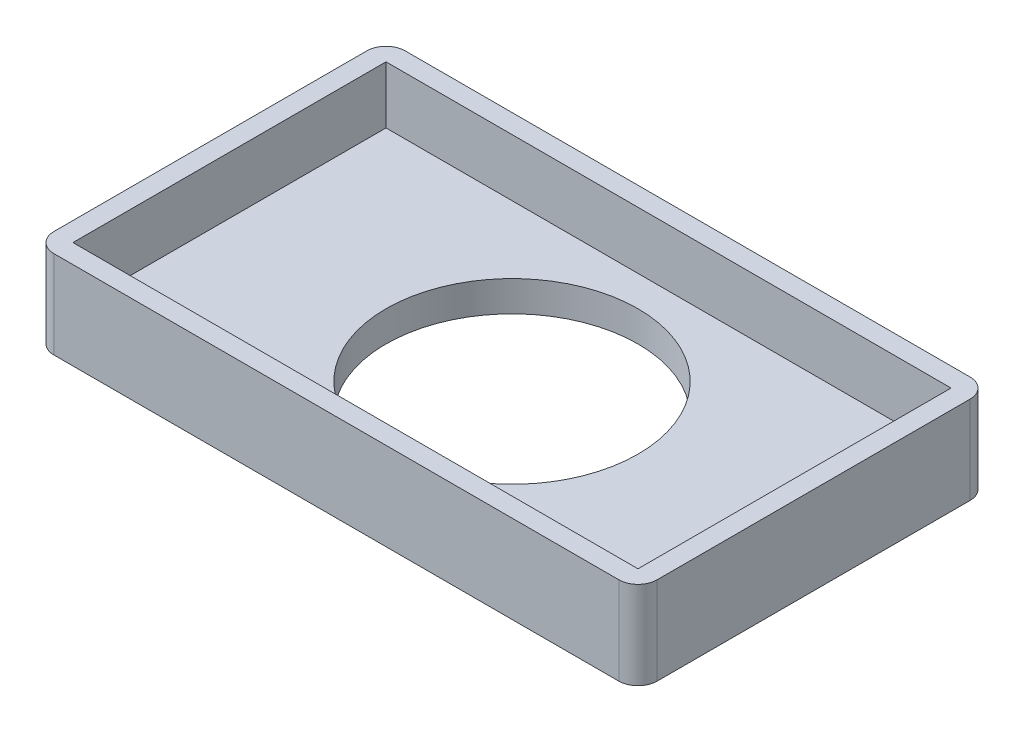
ISO-10303-21;
HEADER;
FILE_DESCRIPTION(('STEP AP214'),'2;1');
FILE_NAME('part.step','',(''),(''),'','','');
FILE_SCHEMA(('AUTOMOTIVE_DESIGN { 1 0 10303 214 1 1 1 1 }'));
ENDSEC;
DATA;
#1=APPLICATION_CONTEXT('core data for automotive mechanical design processes');
#2=APPLICATION_PROTOCOL_DEFINITION('international standard','automotive_design',2000,#1);
#3=PRODUCT_CONTEXT('',#1,'mechanical');
#4=PRODUCT('Part','Part','',(#3));
#5=PRODUCT_RELATED_PRODUCT_CATEGORY('part','',(#4));
#6=PRODUCT_DEFINITION_FORMATION('','',#4);
#7=PRODUCT_DEFINITION_CONTEXT('part definition',#1,'design');
#8=PRODUCT_DEFINITION('design','',#6,#7);
#9=PRODUCT_DEFINITION_SHAPE('','',#8);
#10=(LENGTH_UNIT() NAMED_UNIT(*) SI_UNIT(.MILLI.,.METRE.));
#11=(NAMED_UNIT(*) PLANE_ANGLE_UNIT() SI_UNIT($,.RADIAN.));
#12=(NAMED_UNIT(*) SI_UNIT($,.STERADIAN.) SOLID_ANGLE_UNIT());
#13=UNCERTAINTY_MEASURE_WITH_UNIT(LENGTH_MEASURE(1.E-05),#10,'distance_accuracy_value','');
#14=(GEOMETRIC_REPRESENTATION_CONTEXT(3) GLOBAL_UNCERTAINTY_ASSIGNED_CONTEXT((#13)) GLOBAL_UNIT_ASSIGNED_CONTEXT((#10,
#11,#12)) REPRESENTATION_CONTEXT('',''));
#15=CARTESIAN_POINT('',(0.,0.,0.));
#16=DIRECTION('',(0.,0.,1.));
#17=DIRECTION('',(1.,0.,0.));
#18=AXIS2_PLACEMENT_3D('',#15,#16,#17);
#19=CARTESIAN_POINT('',(79.,8.,-46.));
#20=DIRECTION('',(-1.,0.,0.));
#21=DIRECTION('',(0.,0.,1.));
#22=AXIS2_PLACEMENT_3D('',#19,#20,#21);
#23=PLANE('',#22);
#24=DIRECTION('',(0.,0.,-1.));
#25=VECTOR('',#24,1.);
#26=CARTESIAN_POINT('',(79.,23.,-46.));
#27=LINE('',#26,#25);
#28=CARTESIAN_POINT('',(79.,23.,41.));
#29=VERTEX_POINT('',#28);
#30=CARTESIAN_POINT('',(79.,23.,-41.));
#31=VERTEX_POINT('',#30);
#32=EDGE_CURVE('E146',#29,#31,#27,.T.);
#33=ORIENTED_EDGE('',*,*,#32,.F.);
#34=DIRECTION('',(0.,-1.,0.));
#35=VECTOR('',#34,1.);
#36=CARTESIAN_POINT('',(79.,8.,41.));
#37=LINE('',#36,#35);
#38=CARTESIAN_POINT('',(79.,0.,41.));
#39=VERTEX_POINT('',#38);
#40=EDGE_CURVE('E205',#29,#39,#37,.T.);
#41=ORIENTED_EDGE('',*,*,#40,.T.);
#42=DIRECTION('',(0.,0.,-1.));
#43=VECTOR('',#42,1.);
#44=CARTESIAN_POINT('',(79.,0.,-46.));
#45=LINE('',#44,#43);
#46=CARTESIAN_POINT('',(79.,0.,-41.));
#47=VERTEX_POINT('',#46);
#48=EDGE_CURVE('E179',#39,#47,#45,.T.);
#49=ORIENTED_EDGE('',*,*,#48,.T.);
#50=DIRECTION('',(0.,-1.,0.));
#51=VECTOR('',#50,1.);
#52=CARTESIAN_POINT('',(79.,8.,-41.));
#53=LINE('',#52,#51);
#54=EDGE_CURVE('E203',#47,#31,#53,.F.);
#55=ORIENTED_EDGE('',*,*,#54,.T.);
#56=EDGE_LOOP('',(#33,#41,#49,#55));
#57=FACE_BOUND('',#56,.T.);
#58=ADVANCED_FACE('F35',(#57),#23,.F.);
#59=CARTESIAN_POINT('',(-79.,8.,-46.));
#60=DIRECTION('',(0.,0.,1.));
#61=DIRECTION('',(1.,0.,0.));
#62=AXIS2_PLACEMENT_3D('',#59,#60,#61);
#63=PLANE('',#62);
#64=DIRECTION('',(-1.,0.,0.));
#65=VECTOR('',#64,1.);
#66=CARTESIAN_POINT('',(-79.,23.,-46.));
#67=LINE('',#66,#65);
#68=CARTESIAN_POINT('',(74.,23.,-46.));
#69=VERTEX_POINT('',#68);
#70=CARTESIAN_POINT('',(-74.,23.,-46.));
#71=VERTEX_POINT('',#70);
#72=EDGE_CURVE('E172',#69,#71,#67,.T.);
#73=ORIENTED_EDGE('',*,*,#72,.F.);
#74=DIRECTION('',(0.,-1.,0.));
#75=VECTOR('',#74,1.);
#76=CARTESIAN_POINT('',(74.,8.,-46.));
#77=LINE('',#76,#75);
#78=CARTESIAN_POINT('',(74.,0.,-46.));
#79=VERTEX_POINT('',#78);
#80=EDGE_CURVE('E43',#69,#79,#77,.T.);
#81=ORIENTED_EDGE('',*,*,#80,.T.);
#82=DIRECTION('',(-1.,0.,0.));
#83=VECTOR('',#82,1.);
#84=CARTESIAN_POINT('',(-79.,0.,-46.));
#85=LINE('',#84,#83);
#86=CARTESIAN_POINT('',(-74.,0.,-46.));
#87=VERTEX_POINT('',#86);
#88=EDGE_CURVE('E182',#79,#87,#85,.T.);
#89=ORIENTED_EDGE('',*,*,#88,.T.);
#90=DIRECTION('',(0.,-1.,0.));
#91=VECTOR('',#90,1.);
#92=CARTESIAN_POINT('',(-74.,8.,-46.));
#93=LINE('',#92,#91);
#94=EDGE_CURVE('E50',#87,#71,#93,.F.);
#95=ORIENTED_EDGE('',*,*,#94,.T.);
#96=EDGE_LOOP('',(#73,#81,#89,#95));
#97=FACE_BOUND('',#96,.T.);
#98=ADVANCED_FACE('F224',(#97),#63,.F.);
#99=CARTESIAN_POINT('',(-79.,8.,-46.));
#100=DIRECTION('',(1.,0.,0.));
#101=DIRECTION('',(0.,0.,-1.));
#102=AXIS2_PLACEMENT_3D('',#99,#100,#101);
#103=PLANE('',#102);
#104=DIRECTION('',(0.,0.,1.));
#105=VECTOR('',#104,1.);
#106=CARTESIAN_POINT('',(-79.,23.,-46.));
#107=LINE('',#106,#105);
#108=CARTESIAN_POINT('',(-79.,23.,-41.));
#109=VERTEX_POINT('',#108);
#110=CARTESIAN_POINT('',(-79.,23.,41.));
#111=VERTEX_POINT('',#110);
#112=EDGE_CURVE('E174',#109,#111,#107,.T.);
#113=ORIENTED_EDGE('',*,*,#112,.F.);
#114=DIRECTION('',(0.,-1.,0.));
#115=VECTOR('',#114,1.);
#116=CARTESIAN_POINT('',(-79.,8.,-41.));
#117=LINE('',#116,#115);
#118=CARTESIAN_POINT('',(-79.,0.,-41.));
#119=VERTEX_POINT('',#118);
#120=EDGE_CURVE('E11',#109,#119,#117,.T.);
#121=ORIENTED_EDGE('',*,*,#120,.T.);
#122=DIRECTION('',(0.,0.,1.));
#123=VECTOR('',#122,1.);
#124=CARTESIAN_POINT('',(-79.,0.,-46.));
#125=LINE('',#124,#123);
#126=CARTESIAN_POINT('',(-78.9999999999999,0.,41.));
#127=VERTEX_POINT('',#126);
#128=EDGE_CURVE('E184',#119,#127,#125,.T.);
#129=ORIENTED_EDGE('',*,*,#128,.T.);
#130=DIRECTION('',(0.,-1.,0.));
#131=VECTOR('',#130,1.);
#132=CARTESIAN_POINT('',(-78.9999999999999,8.,41.));
#133=LINE('',#132,#131);
#134=EDGE_CURVE('E198',#127,#111,#133,.F.);
#135=ORIENTED_EDGE('',*,*,#134,.T.);
#136=EDGE_LOOP('',(#113,#121,#129,#135));
#137=FACE_BOUND('',#136,.T.);
#138=ADVANCED_FACE('F235',(#137),#103,.F.);
#139=CARTESIAN_POINT('',(-78.9999999999999,8.,46.));
#140=DIRECTION('',(0.,0.,-1.));
#141=DIRECTION('',(-1.,0.,0.));
#142=AXIS2_PLACEMENT_3D('',#139,#140,#141);
#143=PLANE('',#142);
#144=DIRECTION('',(1.,0.,0.));
#145=VECTOR('',#144,1.);
#146=CARTESIAN_POINT('',(-78.9999999999999,0.,46.));
#147=LINE('',#146,#145);
#148=CARTESIAN_POINT('',(-73.9999999999999,0.,46.));
#149=VERTEX_POINT('',#148);
#150=CARTESIAN_POINT('',(74.,0.,46.));
#151=VERTEX_POINT('',#150);
#152=EDGE_CURVE('E186',#149,#151,#147,.T.);
#153=ORIENTED_EDGE('',*,*,#152,.T.);
#154=DIRECTION('',(0.,-1.,0.));
#155=VECTOR('',#154,1.);
#156=CARTESIAN_POINT('',(74.,8.,46.));
#157=LINE('',#156,#155);
#158=CARTESIAN_POINT('',(74.0000000000001,23.,46.));
#159=VERTEX_POINT('',#158);
#160=EDGE_CURVE('E214',#151,#159,#157,.F.);
#161=ORIENTED_EDGE('',*,*,#160,.T.);
#162=DIRECTION('',(1.,0.,0.));
#163=VECTOR('',#162,1.);
#164=CARTESIAN_POINT('',(-79.,23.,46.));
#165=LINE('',#164,#163);
#166=CARTESIAN_POINT('',(-73.9999999999999,23.,46.));
#167=VERTEX_POINT('',#166);
#168=EDGE_CURVE('E176',#167,#159,#165,.T.);
#169=ORIENTED_EDGE('',*,*,#168,.F.);
#170=DIRECTION('',(0.,-1.,0.));
#171=VECTOR('',#170,1.);
#172=CARTESIAN_POINT('',(-73.9999999999999,8.,46.));
#173=LINE('',#172,#171);
#174=EDGE_CURVE('E189',#167,#149,#173,.T.);
#175=ORIENTED_EDGE('',*,*,#174,.T.);
#176=EDGE_LOOP('',(#153,#161,#169,#175));
#177=FACE_BOUND('',#176,.T.);
#178=ADVANCED_FACE('F243',(#177),#143,.F.);
#179=CARTESIAN_POINT('',(0.,0.,0.));
#180=DIRECTION('',(0.,1.,0.));
#181=DIRECTION('',(0.,0.,1.));
#182=AXIS2_PLACEMENT_3D('',#179,#180,#181);
#183=PLANE('',#182);
#184=CARTESIAN_POINT('',(0.,0.,0.));
#185=DIRECTION('',(0.,-1.,0.));
#186=DIRECTION('',(0.,0.,-1.));
#187=AXIS2_PLACEMENT_3D('',#184,#185,#186);
#188=CIRCLE('',#187,33.);
#189=CARTESIAN_POINT('',(0.,0.,-33.));
#190=VERTEX_POINT('',#189);
#191=EDGE_CURVE('E192',#190,#190,#188,.T.);
#192=ORIENTED_EDGE('',*,*,#191,.F.);
#193=EDGE_LOOP('',(#192));
#194=FACE_BOUND('',#193,.T.);
#195=ORIENTED_EDGE('',*,*,#48,.F.);
#196=CARTESIAN_POINT('',(74.,0.,41.));
#197=DIRECTION('',(0.,1.,0.));
#198=DIRECTION('',(0.,0.,1.));
#199=AXIS2_PLACEMENT_3D('',#196,#197,#198);
#200=CIRCLE('',#199,5.);
#201=EDGE_CURVE('E212',#39,#151,#200,.F.);
#202=ORIENTED_EDGE('',*,*,#201,.T.);
#203=ORIENTED_EDGE('',*,*,#152,.F.);
#204=CARTESIAN_POINT('',(-73.9999999999999,0.,41.));
#205=DIRECTION('',(0.,1.,0.));
#206=DIRECTION('',(0.,0.,1.));
#207=AXIS2_PLACEMENT_3D('',#204,#205,#206);
#208=CIRCLE('',#207,5.);
#209=EDGE_CURVE('E195',#149,#127,#208,.F.);
#210=ORIENTED_EDGE('',*,*,#209,.T.);
#211=ORIENTED_EDGE('',*,*,#128,.F.);
#212=CARTESIAN_POINT('',(-74.,0.,-41.));
#213=DIRECTION('',(0.,1.,0.));
#214=DIRECTION('',(0.,0.,1.));
#215=AXIS2_PLACEMENT_3D('',#212,#213,#214);
#216=CIRCLE('',#215,5.);
#217=EDGE_CURVE('E208',#119,#87,#216,.F.);
#218=ORIENTED_EDGE('',*,*,#217,.T.);
#219=ORIENTED_EDGE('',*,*,#88,.F.);
#220=CARTESIAN_POINT('',(74.,0.,-41.));
#221=DIRECTION('',(0.,1.,0.));
#222=DIRECTION('',(0.,0.,1.));
#223=AXIS2_PLACEMENT_3D('',#220,#221,#222);
#224=CIRCLE('',#223,5.);
#225=EDGE_CURVE('E210',#79,#47,#224,.F.);
#226=ORIENTED_EDGE('',*,*,#225,.T.);
#227=EDGE_LOOP('',(#195,#202,#203,#210,#211,#218,#219,#226));
#228=FACE_BOUND('',#227,.T.);
#229=ADVANCED_FACE('F228',(#194,#228),#183,.F.);
#230=CARTESIAN_POINT('',(0.,23.,0.));
#231=DIRECTION('',(0.,1.,0.));
#232=DIRECTION('',(0.,0.,1.));
#233=AXIS2_PLACEMENT_3D('',#230,#231,#232);
#234=PLANE('',#233);
#235=ORIENTED_EDGE('',*,*,#168,.T.);
#236=CARTESIAN_POINT('',(74.,23.,41.));
#237=DIRECTION('',(0.,1.,0.));
#238=DIRECTION('',(0.,0.,1.));
#239=AXIS2_PLACEMENT_3D('',#236,#237,#238);
#240=CIRCLE('',#239,5.);
#241=EDGE_CURVE('E219',#159,#29,#240,.T.);
#242=ORIENTED_EDGE('',*,*,#241,.T.);
#243=ORIENTED_EDGE('',*,*,#32,.T.);
#244=CARTESIAN_POINT('',(74.,23.,-41.));
#245=DIRECTION('',(0.,1.,0.));
#246=DIRECTION('',(0.,0.,1.));
#247=AXIS2_PLACEMENT_3D('',#244,#245,#246);
#248=CIRCLE('',#247,5.);
#249=EDGE_CURVE('E57',#31,#69,#248,.T.);
#250=ORIENTED_EDGE('',*,*,#249,.T.);
#251=ORIENTED_EDGE('',*,*,#72,.T.);
#252=CARTESIAN_POINT('',(-74.,23.,-41.));
#253=DIRECTION('',(0.,1.,0.));
#254=DIRECTION('',(0.,0.,1.));
#255=AXIS2_PLACEMENT_3D('',#252,#253,#254);
#256=CIRCLE('',#255,5.);
#257=EDGE_CURVE('E216',#71,#109,#256,.T.);
#258=ORIENTED_EDGE('',*,*,#257,.T.);
#259=ORIENTED_EDGE('',*,*,#112,.T.);
#260=CARTESIAN_POINT('',(-73.9999999999999,23.,41.));
#261=DIRECTION('',(0.,1.,0.));
#262=DIRECTION('',(0.,0.,1.));
#263=AXIS2_PLACEMENT_3D('',#260,#261,#262);
#264=CIRCLE('',#263,5.);
#265=EDGE_CURVE('E201',#111,#167,#264,.T.);
#266=ORIENTED_EDGE('',*,*,#265,.T.);
#267=EDGE_LOOP('',(#235,#242,#243,#250,#251,#258,#259,#266));
#268=FACE_BOUND('',#267,.T.);
#269=DIRECTION('',(-1.,0.,0.));
#270=VECTOR('',#269,1.);
#271=CARTESIAN_POINT('',(-74.,23.,-41.));
#272=LINE('',#271,#270);
#273=CARTESIAN_POINT('',(74.,23.,-41.));
#274=VERTEX_POINT('',#273);
#275=CARTESIAN_POINT('',(-74.,23.,-41.));
#276=VERTEX_POINT('',#275);
#277=EDGE_CURVE('E137',#274,#276,#272,.T.);
#278=ORIENTED_EDGE('',*,*,#277,.F.);
#279=DIRECTION('',(0.,0.,-1.));
#280=VECTOR('',#279,1.);
#281=CARTESIAN_POINT('',(74.,23.,-41.));
#282=LINE('',#281,#280);
#283=CARTESIAN_POINT('',(74.,23.,41.));
#284=VERTEX_POINT('',#283);
#285=EDGE_CURVE('E127',#284,#274,#282,.T.);
#286=ORIENTED_EDGE('',*,*,#285,.F.);
#287=DIRECTION('',(1.,0.,0.));
#288=VECTOR('',#287,1.);
#289=CARTESIAN_POINT('',(-74.,23.,41.));
#290=LINE('',#289,#288);
#291=CARTESIAN_POINT('',(-74.,23.,41.));
#292=VERTEX_POINT('',#291);
#293=EDGE_CURVE('E154',#292,#284,#290,.T.);
#294=ORIENTED_EDGE('',*,*,#293,.F.);
#295=DIRECTION('',(0.,0.,1.));
#296=VECTOR('',#295,1.);
#297=CARTESIAN_POINT('',(-74.,23.,-41.));
#298=LINE('',#297,#296);
#299=EDGE_CURVE('E152',#276,#292,#298,.T.);
#300=ORIENTED_EDGE('',*,*,#299,.F.);
#301=EDGE_LOOP('',(#278,#286,#294,#300));
#302=FACE_BOUND('',#301,.T.);
#303=ADVANCED_FACE('F150',(#268,#302),#234,.T.);
#304=CARTESIAN_POINT('',(74.,23.,-41.));
#305=DIRECTION('',(-1.,0.,0.));
#306=DIRECTION('',(0.,0.,1.));
#307=AXIS2_PLACEMENT_3D('',#304,#305,#306);
#308=PLANE('',#307);
#309=DIRECTION('',(0.,0.,-1.));
#310=VECTOR('',#309,1.);
#311=CARTESIAN_POINT('',(74.,8.,-41.));
#312=LINE('',#311,#310);
#313=CARTESIAN_POINT('',(74.,8.,41.));
#314=VERTEX_POINT('',#313);
#315=CARTESIAN_POINT('',(74.,8.,-41.));
#316=VERTEX_POINT('',#315);
#317=EDGE_CURVE('E159',#314,#316,#312,.T.);
#318=ORIENTED_EDGE('',*,*,#317,.F.);
#319=DIRECTION('',(0.,-1.,0.));
#320=VECTOR('',#319,1.);
#321=CARTESIAN_POINT('',(74.,23.,41.));
#322=LINE('',#321,#320);
#323=EDGE_CURVE('E133',#284,#314,#322,.T.);
#324=ORIENTED_EDGE('',*,*,#323,.F.);
#325=ORIENTED_EDGE('',*,*,#285,.T.);
#326=DIRECTION('',(0.,-1.,0.));
#327=VECTOR('',#326,1.);
#328=CARTESIAN_POINT('',(74.,23.,-41.));
#329=LINE('',#328,#327);
#330=EDGE_CURVE('E131',#274,#316,#329,.T.);
#331=ORIENTED_EDGE('',*,*,#330,.T.);
#332=EDGE_LOOP('',(#318,#324,#325,#331));
#333=FACE_BOUND('',#332,.T.);
#334=ADVANCED_FACE('F130',(#333),#308,.T.);
#335=CARTESIAN_POINT('',(-74.,23.,-41.));
#336=DIRECTION('',(0.,0.,1.));
#337=DIRECTION('',(1.,0.,0.));
#338=AXIS2_PLACEMENT_3D('',#335,#336,#337);
#339=PLANE('',#338);
#340=DIRECTION('',(-1.,0.,0.));
#341=VECTOR('',#340,1.);
#342=CARTESIAN_POINT('',(-74.,8.,-41.));
#343=LINE('',#342,#341);
#344=CARTESIAN_POINT('',(-74.,8.,-41.));
#345=VERTEX_POINT('',#344);
#346=EDGE_CURVE('E145',#316,#345,#343,.T.);
#347=ORIENTED_EDGE('',*,*,#346,.F.);
#348=ORIENTED_EDGE('',*,*,#330,.F.);
#349=ORIENTED_EDGE('',*,*,#277,.T.);
#350=DIRECTION('',(0.,-1.,0.));
#351=VECTOR('',#350,1.);
#352=CARTESIAN_POINT('',(-74.,23.,-41.));
#353=LINE('',#352,#351);
#354=EDGE_CURVE('E147',#276,#345,#353,.T.);
#355=ORIENTED_EDGE('',*,*,#354,.T.);
#356=EDGE_LOOP('',(#347,#348,#349,#355));
#357=FACE_BOUND('',#356,.T.);
#358=ADVANCED_FACE('F142',(#357),#339,.T.);
#359=CARTESIAN_POINT('',(-74.,23.,-41.));
#360=DIRECTION('',(1.,0.,0.));
#361=DIRECTION('',(0.,0.,-1.));
#362=AXIS2_PLACEMENT_3D('',#359,#360,#361);
#363=PLANE('',#362);
#364=DIRECTION('',(0.,0.,1.));
#365=VECTOR('',#364,1.);
#366=CARTESIAN_POINT('',(-74.,8.,-41.));
#367=LINE('',#366,#365);
#368=CARTESIAN_POINT('',(-74.,8.,41.));
#369=VERTEX_POINT('',#368);
#370=EDGE_CURVE('E163',#345,#369,#367,.T.);
#371=ORIENTED_EDGE('',*,*,#370,.F.);
#372=ORIENTED_EDGE('',*,*,#354,.F.);
#373=ORIENTED_EDGE('',*,*,#299,.T.);
#374=DIRECTION('',(0.,-1.,0.));
#375=VECTOR('',#374,1.);
#376=CARTESIAN_POINT('',(-74.,23.,41.));
#377=LINE('',#376,#375);
#378=EDGE_CURVE('E167',#292,#369,#377,.T.);
#379=ORIENTED_EDGE('',*,*,#378,.T.);
#380=EDGE_LOOP('',(#371,#372,#373,#379));
#381=FACE_BOUND('',#380,.T.);
#382=ADVANCED_FACE('F286',(#381),#363,.T.);
#383=CARTESIAN_POINT('',(-74.,23.,41.));
#384=DIRECTION('',(0.,0.,-1.));
#385=DIRECTION('',(-1.,0.,0.));
#386=AXIS2_PLACEMENT_3D('',#383,#384,#385);
#387=PLANE('',#386);
#388=DIRECTION('',(1.,0.,0.));
#389=VECTOR('',#388,1.);
#390=CARTESIAN_POINT('',(-74.,8.,41.));
#391=LINE('',#390,#389);
#392=EDGE_CURVE('E138',#369,#314,#391,.T.);
#393=ORIENTED_EDGE('',*,*,#392,.F.);
#394=ORIENTED_EDGE('',*,*,#378,.F.);
#395=ORIENTED_EDGE('',*,*,#293,.T.);
#396=ORIENTED_EDGE('',*,*,#323,.T.);
#397=EDGE_LOOP('',(#393,#394,#395,#396));
#398=FACE_BOUND('',#397,.T.);
#399=ADVANCED_FACE('F279',(#398),#387,.T.);
#400=CARTESIAN_POINT('',(0.,8.,0.));
#401=DIRECTION('',(0.,1.,0.));
#402=DIRECTION('',(0.,0.,1.));
#403=AXIS2_PLACEMENT_3D('',#400,#401,#402);
#404=PLANE('',#403);
#405=CARTESIAN_POINT('',(0.,8.,0.));
#406=DIRECTION('',(0.,1.,0.));
#407=DIRECTION('',(0.,0.,1.));
#408=AXIS2_PLACEMENT_3D('',#405,#406,#407);
#409=CIRCLE('',#408,33.);
#410=CARTESIAN_POINT('',(0.,8.,33.));
#411=VERTEX_POINT('',#410);
#412=EDGE_CURVE('E161',#411,#411,#409,.T.);
#413=ORIENTED_EDGE('',*,*,#412,.F.);
#414=EDGE_LOOP('',(#413));
#415=FACE_BOUND('',#414,.T.);
#416=ORIENTED_EDGE('',*,*,#317,.T.);
#417=ORIENTED_EDGE('',*,*,#346,.T.);
#418=ORIENTED_EDGE('',*,*,#370,.T.);
#419=ORIENTED_EDGE('',*,*,#392,.T.);
#420=EDGE_LOOP('',(#416,#417,#418,#419));
#421=FACE_BOUND('',#420,.T.);
#422=ADVANCED_FACE('F273',(#415,#421),#404,.T.);
#423=CARTESIAN_POINT('',(0.,23.,0.));
#424=DIRECTION('',(0.,-1.,0.));
#425=DIRECTION('',(0.,0.,-1.));
#426=AXIS2_PLACEMENT_3D('',#423,#424,#425);
#427=CYLINDRICAL_SURFACE('',#426,33.);
#428=ORIENTED_EDGE('',*,*,#412,.T.);
#429=EDGE_LOOP('',(#428));
#430=FACE_BOUND('',#429,.T.);
#431=ORIENTED_EDGE('',*,*,#191,.T.);
#432=EDGE_LOOP('',(#431));
#433=FACE_BOUND('',#432,.T.);
#434=ADVANCED_FACE('F269',(#430,#433),#427,.F.);
#435=CARTESIAN_POINT('',(-73.9999999999999,8.,41.));
#436=DIRECTION('',(0.,-1.,0.));
#437=DIRECTION('',(0.,0.,-1.));
#438=AXIS2_PLACEMENT_3D('',#435,#436,#437);
#439=CYLINDRICAL_SURFACE('',#438,5.);
#440=ORIENTED_EDGE('',*,*,#265,.F.);
#441=ORIENTED_EDGE('',*,*,#134,.F.);
#442=ORIENTED_EDGE('',*,*,#209,.F.);
#443=ORIENTED_EDGE('',*,*,#174,.F.);
#444=EDGE_LOOP('',(#440,#441,#442,#443));
#445=FACE_BOUND('',#444,.T.);
#446=ADVANCED_FACE('F246',(#445),#439,.T.);
#447=CARTESIAN_POINT('',(74.,8.,41.));
#448=DIRECTION('',(0.,-1.,0.));
#449=DIRECTION('',(0.,0.,-1.));
#450=AXIS2_PLACEMENT_3D('',#447,#448,#449);
#451=CYLINDRICAL_SURFACE('',#450,5.);
#452=ORIENTED_EDGE('',*,*,#241,.F.);
#453=ORIENTED_EDGE('',*,*,#160,.F.);
#454=ORIENTED_EDGE('',*,*,#201,.F.);
#455=ORIENTED_EDGE('',*,*,#40,.F.);
#456=EDGE_LOOP('',(#452,#453,#454,#455));
#457=FACE_BOUND('',#456,.T.);
#458=ADVANCED_FACE('F248',(#457),#451,.T.);
#459=CARTESIAN_POINT('',(74.,8.,-41.));
#460=DIRECTION('',(0.,-1.,0.));
#461=DIRECTION('',(0.,0.,-1.));
#462=AXIS2_PLACEMENT_3D('',#459,#460,#461);
#463=CYLINDRICAL_SURFACE('',#462,5.);
#464=ORIENTED_EDGE('',*,*,#249,.F.);
#465=ORIENTED_EDGE('',*,*,#54,.F.);
#466=ORIENTED_EDGE('',*,*,#225,.F.);
#467=ORIENTED_EDGE('',*,*,#80,.F.);
#468=EDGE_LOOP('',(#464,#465,#466,#467));
#469=FACE_BOUND('',#468,.T.);
#470=ADVANCED_FACE('F253',(#469),#463,.T.);
#471=CARTESIAN_POINT('',(-74.,8.,-41.));
#472=DIRECTION('',(0.,-1.,0.));
#473=DIRECTION('',(0.,0.,-1.));
#474=AXIS2_PLACEMENT_3D('',#471,#472,#473);
#475=CYLINDRICAL_SURFACE('',#474,5.);
#476=ORIENTED_EDGE('',*,*,#257,.F.);
#477=ORIENTED_EDGE('',*,*,#94,.F.);
#478=ORIENTED_EDGE('',*,*,#217,.F.);
#479=ORIENTED_EDGE('',*,*,#120,.F.);
#480=EDGE_LOOP('',(#476,#477,#478,#479));
#481=FACE_BOUND('',#480,.T.);
#482=ADVANCED_FACE('F37',(#481),#475,.T.);
#483=CLOSED_SHELL('',(#58,#98,#138,#178,#229,#303,#334,#358,#382,#399,#422,#434,#446,#458,#470,#482));
#484=MANIFOLD_SOLID_BREP('B2',#483);
#485=ADVANCED_BREP_SHAPE_REPRESENTATION('',(#18,#484),#14);
#486=SHAPE_DEFINITION_REPRESENTATION(#9,#485);
ENDSEC;
END-ISO-10303-21;
